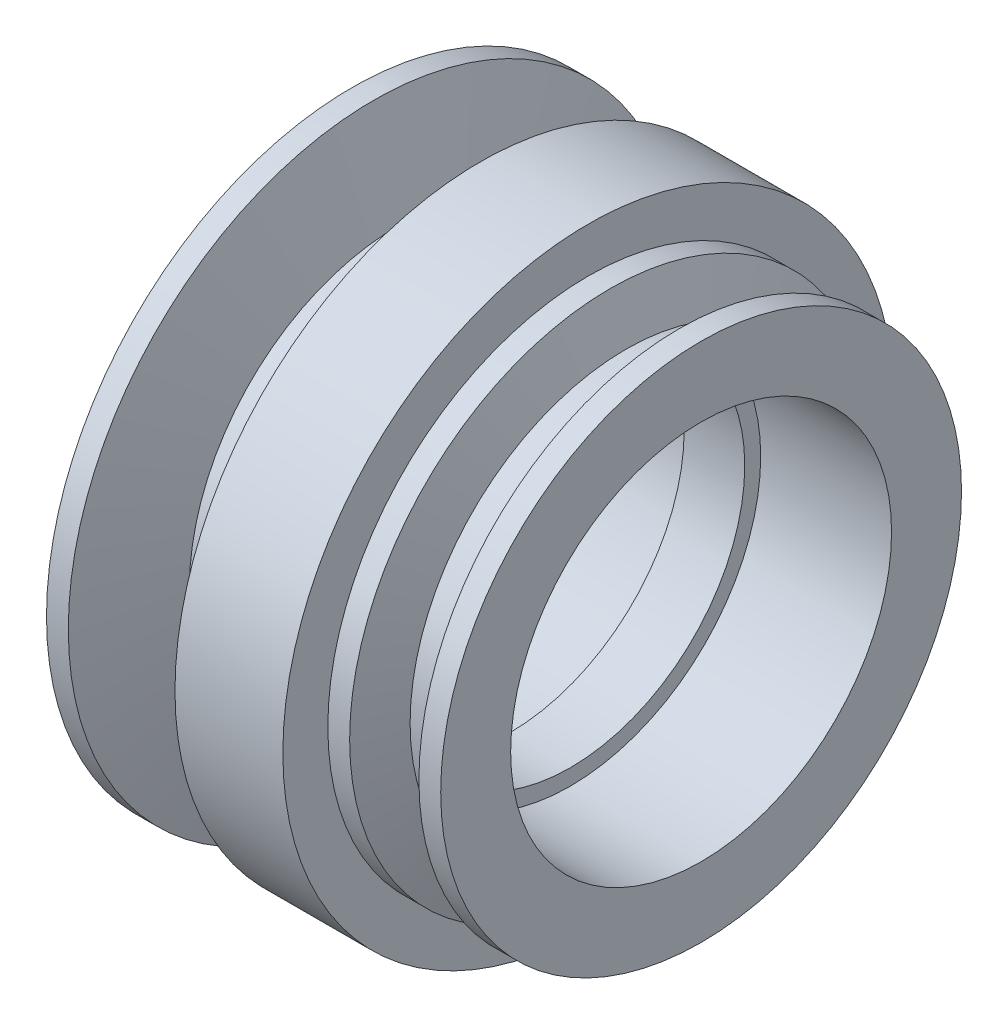
ISO-10303-21;
HEADER;
FILE_DESCRIPTION(('STEP AP214'),'2;1');
FILE_NAME('part.step','',(''),(''),'','','');
FILE_SCHEMA(('AUTOMOTIVE_DESIGN { 1 0 10303 214 1 1 1 1 }'));
ENDSEC;
DATA;
#1=APPLICATION_CONTEXT('core data for automotive mechanical design processes');
#2=APPLICATION_PROTOCOL_DEFINITION('international standard','automotive_design',2000,#1);
#3=PRODUCT_CONTEXT('',#1,'mechanical');
#4=PRODUCT('Part','Part','',(#3));
#5=PRODUCT_RELATED_PRODUCT_CATEGORY('part','',(#4));
#6=PRODUCT_DEFINITION_FORMATION('','',#4);
#7=PRODUCT_DEFINITION_CONTEXT('part definition',#1,'design');
#8=PRODUCT_DEFINITION('design','',#6,#7);
#9=PRODUCT_DEFINITION_SHAPE('','',#8);
#10=(LENGTH_UNIT() NAMED_UNIT(*) SI_UNIT(.MILLI.,.METRE.));
#11=(NAMED_UNIT(*) PLANE_ANGLE_UNIT() SI_UNIT($,.RADIAN.));
#12=(NAMED_UNIT(*) SI_UNIT($,.STERADIAN.) SOLID_ANGLE_UNIT());
#13=UNCERTAINTY_MEASURE_WITH_UNIT(LENGTH_MEASURE(1.E-05),#10,'distance_accuracy_value','');
#14=(GEOMETRIC_REPRESENTATION_CONTEXT(3) GLOBAL_UNCERTAINTY_ASSIGNED_CONTEXT((#13)) GLOBAL_UNIT_ASSIGNED_CONTEXT((#10,
#11,#12)) REPRESENTATION_CONTEXT('',''));
#15=CARTESIAN_POINT('',(0.,0.,0.));
#16=DIRECTION('',(0.,0.,1.));
#17=DIRECTION('',(1.,0.,0.));
#18=AXIS2_PLACEMENT_3D('',#15,#16,#17);
#19=CARTESIAN_POINT('',(-1.54130278169073,0.,-16.));
#20=DIRECTION('',(1.,0.,0.));
#21=DIRECTION('',(0.,0.,-1.));
#22=AXIS2_PLACEMENT_3D('',#19,#20,#21);
#23=PLANE('',#22);
#24=CARTESIAN_POINT('',(-1.54130278169073,0.,0.));
#25=DIRECTION('',(-1.,0.,0.));
#26=DIRECTION('',(0.,0.,1.));
#27=AXIS2_PLACEMENT_3D('',#24,#25,#26);
#28=CIRCLE('',#27,16.);
#29=CARTESIAN_POINT('',(-1.54130278169073,0.,16.));
#30=VERTEX_POINT('',#29);
#31=EDGE_CURVE('E10',#30,#30,#28,.T.);
#32=ORIENTED_EDGE('',*,*,#31,.F.);
#33=EDGE_LOOP('',(#32));
#34=FACE_BOUND('',#33,.T.);
#35=CARTESIAN_POINT('',(-1.54130278169073,0.,0.));
#36=DIRECTION('',(-1.,0.,0.));
#37=DIRECTION('',(0.,0.,1.));
#38=AXIS2_PLACEMENT_3D('',#35,#36,#37);
#39=CIRCLE('',#38,17.4625);
#40=CARTESIAN_POINT('',(-1.54130278169073,0.,17.4625));
#41=VERTEX_POINT('',#40);
#42=EDGE_CURVE('E95',#41,#41,#39,.T.);
#43=ORIENTED_EDGE('',*,*,#42,.T.);
#44=EDGE_LOOP('',(#43));
#45=FACE_BOUND('',#44,.T.);
#46=ADVANCED_FACE('F37',(#34,#45),#23,.F.);
#47=CARTESIAN_POINT('',(-72.0125837658216,0.,0.));
#48=DIRECTION('',(-1.,0.,0.));
#49=DIRECTION('',(0.,0.,1.));
#50=AXIS2_PLACEMENT_3D('',#47,#48,#49);
#51=CYLINDRICAL_SURFACE('',#50,16.);
#52=CARTESIAN_POINT('',(4.01229721830917,0.,0.));
#53=DIRECTION('',(-1.,0.,0.));
#54=DIRECTION('',(0.,0.,1.));
#55=AXIS2_PLACEMENT_3D('',#52,#53,#54);
#56=CIRCLE('',#55,16.);
#57=CARTESIAN_POINT('',(4.01229721830917,0.,16.));
#58=VERTEX_POINT('',#57);
#59=EDGE_CURVE('E43',#58,#58,#56,.T.);
#60=ORIENTED_EDGE('',*,*,#59,.F.);
#61=EDGE_LOOP('',(#60));
#62=FACE_BOUND('',#61,.T.);
#63=ORIENTED_EDGE('',*,*,#31,.T.);
#64=EDGE_LOOP('',(#63));
#65=FACE_BOUND('',#64,.T.);
#66=ADVANCED_FACE('F192',(#62,#65),#51,.F.);
#67=CARTESIAN_POINT('',(4.01229721830917,0.,-16.));
#68=DIRECTION('',(-1.,0.,0.));
#69=DIRECTION('',(0.,0.,1.));
#70=AXIS2_PLACEMENT_3D('',#67,#68,#69);
#71=PLANE('',#70);
#72=CARTESIAN_POINT('',(4.01229721830917,0.,0.));
#73=DIRECTION('',(-1.,0.,0.));
#74=DIRECTION('',(0.,0.,1.));
#75=AXIS2_PLACEMENT_3D('',#72,#73,#74);
#76=CIRCLE('',#75,17.4625);
#77=CARTESIAN_POINT('',(4.01229721830917,0.,17.4625));
#78=VERTEX_POINT('',#77);
#79=EDGE_CURVE('E47',#78,#78,#76,.T.);
#80=ORIENTED_EDGE('',*,*,#79,.F.);
#81=EDGE_LOOP('',(#80));
#82=FACE_BOUND('',#81,.T.);
#83=ORIENTED_EDGE('',*,*,#59,.T.);
#84=EDGE_LOOP('',(#83));
#85=FACE_BOUND('',#84,.T.);
#86=ADVANCED_FACE('F187',(#82,#85),#71,.F.);
#87=CARTESIAN_POINT('',(-72.0125837658216,0.,0.));
#88=DIRECTION('',(-1.,0.,0.));
#89=DIRECTION('',(0.,0.,1.));
#90=AXIS2_PLACEMENT_3D('',#87,#88,#89);
#91=CYLINDRICAL_SURFACE('',#90,17.4625);
#92=CARTESIAN_POINT('',(16.0104972183091,0.,0.));
#93=DIRECTION('',(-1.,0.,0.));
#94=DIRECTION('',(0.,0.,1.));
#95=AXIS2_PLACEMENT_3D('',#92,#93,#94);
#96=CIRCLE('',#95,17.4625);
#97=CARTESIAN_POINT('',(16.0104972183091,0.,17.4625));
#98=VERTEX_POINT('',#97);
#99=EDGE_CURVE('E51',#98,#98,#96,.T.);
#100=ORIENTED_EDGE('',*,*,#99,.F.);
#101=EDGE_LOOP('',(#100));
#102=FACE_BOUND('',#101,.T.);
#103=ORIENTED_EDGE('',*,*,#79,.T.);
#104=EDGE_LOOP('',(#103));
#105=FACE_BOUND('',#104,.T.);
#106=ADVANCED_FACE('F181',(#102,#105),#91,.F.);
#107=CARTESIAN_POINT('',(16.0104972183091,0.,-23.876));
#108=DIRECTION('',(-1.,0.,0.));
#109=DIRECTION('',(0.,0.,1.));
#110=AXIS2_PLACEMENT_3D('',#107,#108,#109);
#111=PLANE('',#110);
#112=CARTESIAN_POINT('',(16.0104972183092,0.,0.));
#113=DIRECTION('',(-1.,0.,0.));
#114=DIRECTION('',(0.,0.,1.));
#115=AXIS2_PLACEMENT_3D('',#112,#113,#114);
#116=CIRCLE('',#115,23.876);
#117=CARTESIAN_POINT('',(16.0104972183092,0.,23.876));
#118=VERTEX_POINT('',#117);
#119=EDGE_CURVE('E56',#118,#118,#116,.T.);
#120=ORIENTED_EDGE('',*,*,#119,.F.);
#121=EDGE_LOOP('',(#120));
#122=FACE_BOUND('',#121,.T.);
#123=ORIENTED_EDGE('',*,*,#99,.T.);
#124=EDGE_LOOP('',(#123));
#125=FACE_BOUND('',#124,.T.);
#126=ADVANCED_FACE('F175',(#122,#125),#111,.F.);
#127=CARTESIAN_POINT('',(-72.0125837658216,0.,0.));
#128=DIRECTION('',(-1.,0.,0.));
#129=DIRECTION('',(0.,0.,1.));
#130=AXIS2_PLACEMENT_3D('',#127,#128,#129);
#131=CYLINDRICAL_SURFACE('',#130,23.876);
#132=CARTESIAN_POINT('',(14.0104972183092,0.,0.));
#133=DIRECTION('',(-1.,0.,0.));
#134=DIRECTION('',(0.,0.,1.));
#135=AXIS2_PLACEMENT_3D('',#132,#133,#134);
#136=CIRCLE('',#135,23.876);
#137=CARTESIAN_POINT('',(14.0104972183092,0.,23.876));
#138=VERTEX_POINT('',#137);
#139=EDGE_CURVE('E59',#138,#138,#136,.T.);
#140=ORIENTED_EDGE('',*,*,#139,.F.);
#141=EDGE_LOOP('',(#140));
#142=FACE_BOUND('',#141,.T.);
#143=ORIENTED_EDGE('',*,*,#119,.T.);
#144=EDGE_LOOP('',(#143));
#145=FACE_BOUND('',#144,.T.);
#146=ADVANCED_FACE('F169',(#142,#145),#131,.T.);
#147=CARTESIAN_POINT('',(14.0104972183092,0.,0.));
#148=DIRECTION('',(1.,0.,0.));
#149=DIRECTION('',(0.,0.,-1.));
#150=AXIS2_PLACEMENT_3D('',#147,#148,#149);
#151=CONICAL_SURFACE('',#150,23.876,1.22173047639603);
#152=CARTESIAN_POINT('',(12.5313221862513,0.,0.));
#153=DIRECTION('',(-1.,0.,0.));
#154=DIRECTION('',(0.,0.,1.));
#155=AXIS2_PLACEMENT_3D('',#152,#153,#154);
#156=CIRCLE('',#155,19.812);
#157=CARTESIAN_POINT('',(12.5313221862513,0.,19.812));
#158=VERTEX_POINT('',#157);
#159=EDGE_CURVE('E62',#158,#158,#156,.T.);
#160=ORIENTED_EDGE('',*,*,#159,.F.);
#161=EDGE_LOOP('',(#160));
#162=FACE_BOUND('',#161,.T.);
#163=ORIENTED_EDGE('',*,*,#139,.T.);
#164=EDGE_LOOP('',(#163));
#165=FACE_BOUND('',#164,.T.);
#166=ADVANCED_FACE('F163',(#162,#165),#151,.T.);
#167=CARTESIAN_POINT('',(-72.0125837658216,0.,0.));
#168=DIRECTION('',(-1.,0.,0.));
#169=DIRECTION('',(0.,0.,1.));
#170=AXIS2_PLACEMENT_3D('',#167,#168,#169);
#171=CYLINDRICAL_SURFACE('',#170,19.812);
#172=CARTESIAN_POINT('',(9.13967225036697,0.,0.));
#173=DIRECTION('',(-1.,0.,0.));
#174=DIRECTION('',(0.,0.,1.));
#175=AXIS2_PLACEMENT_3D('',#172,#173,#174);
#176=CIRCLE('',#175,19.812);
#177=CARTESIAN_POINT('',(9.13967225036697,0.,19.812));
#178=VERTEX_POINT('',#177);
#179=EDGE_CURVE('E65',#178,#178,#176,.T.);
#180=ORIENTED_EDGE('',*,*,#179,.F.);
#181=EDGE_LOOP('',(#180));
#182=FACE_BOUND('',#181,.T.);
#183=ORIENTED_EDGE('',*,*,#159,.T.);
#184=EDGE_LOOP('',(#183));
#185=FACE_BOUND('',#184,.T.);
#186=ADVANCED_FACE('F157',(#182,#185),#171,.T.);
#187=CARTESIAN_POINT('',(9.13967225036697,0.,0.));
#188=DIRECTION('',(-1.,0.,0.));
#189=DIRECTION('',(0.,0.,1.));
#190=AXIS2_PLACEMENT_3D('',#187,#188,#189);
#191=CONICAL_SURFACE('',#190,19.812,1.22173047639603);
#192=CARTESIAN_POINT('',(7.66049721830914,0.,0.));
#193=DIRECTION('',(-1.,0.,0.));
#194=DIRECTION('',(0.,0.,1.));
#195=AXIS2_PLACEMENT_3D('',#192,#193,#194);
#196=CIRCLE('',#195,23.876);
#197=CARTESIAN_POINT('',(7.66049721830914,0.,23.876));
#198=VERTEX_POINT('',#197);
#199=EDGE_CURVE('E68',#198,#198,#196,.T.);
#200=ORIENTED_EDGE('',*,*,#199,.F.);
#201=EDGE_LOOP('',(#200));
#202=FACE_BOUND('',#201,.T.);
#203=ORIENTED_EDGE('',*,*,#179,.T.);
#204=EDGE_LOOP('',(#203));
#205=FACE_BOUND('',#204,.T.);
#206=ADVANCED_FACE('F151',(#202,#205),#191,.T.);
#207=CARTESIAN_POINT('',(-72.0125837658216,0.,0.));
#208=DIRECTION('',(-1.,0.,0.));
#209=DIRECTION('',(0.,0.,1.));
#210=AXIS2_PLACEMENT_3D('',#207,#208,#209);
#211=CYLINDRICAL_SURFACE('',#210,23.876);
#212=CARTESIAN_POINT('',(5.66049721830914,0.,0.));
#213=DIRECTION('',(-1.,0.,0.));
#214=DIRECTION('',(0.,0.,1.));
#215=AXIS2_PLACEMENT_3D('',#212,#213,#214);
#216=CIRCLE('',#215,23.876);
#217=CARTESIAN_POINT('',(5.66049721830914,0.,23.876));
#218=VERTEX_POINT('',#217);
#219=EDGE_CURVE('E71',#218,#218,#216,.T.);
#220=ORIENTED_EDGE('',*,*,#219,.F.);
#221=EDGE_LOOP('',(#220));
#222=FACE_BOUND('',#221,.T.);
#223=ORIENTED_EDGE('',*,*,#199,.T.);
#224=EDGE_LOOP('',(#223));
#225=FACE_BOUND('',#224,.T.);
#226=ADVANCED_FACE('F145',(#222,#225),#211,.T.);
#227=CARTESIAN_POINT('',(5.66049721830914,0.,-28.));
#228=DIRECTION('',(-1.,0.,0.));
#229=DIRECTION('',(0.,0.,1.));
#230=AXIS2_PLACEMENT_3D('',#227,#228,#229);
#231=PLANE('',#230);
#232=CARTESIAN_POINT('',(5.66049721830914,0.,0.));
#233=DIRECTION('',(-1.,0.,0.));
#234=DIRECTION('',(0.,0.,1.));
#235=AXIS2_PLACEMENT_3D('',#232,#233,#234);
#236=CIRCLE('',#235,28.);
#237=CARTESIAN_POINT('',(5.66049721830914,0.,28.));
#238=VERTEX_POINT('',#237);
#239=EDGE_CURVE('E74',#238,#238,#236,.T.);
#240=ORIENTED_EDGE('',*,*,#239,.F.);
#241=EDGE_LOOP('',(#240));
#242=FACE_BOUND('',#241,.T.);
#243=ORIENTED_EDGE('',*,*,#219,.T.);
#244=EDGE_LOOP('',(#243));
#245=FACE_BOUND('',#244,.T.);
#246=ADVANCED_FACE('F139',(#242,#245),#231,.F.);
#247=CARTESIAN_POINT('',(-72.0125837658216,0.,0.));
#248=DIRECTION('',(-1.,0.,0.));
#249=DIRECTION('',(0.,0.,1.));
#250=AXIS2_PLACEMENT_3D('',#247,#248,#249);
#251=CYLINDRICAL_SURFACE('',#250,28.);
#252=CARTESIAN_POINT('',(-4.23149721830912,0.,0.));
#253=DIRECTION('',(-1.,0.,0.));
#254=DIRECTION('',(0.,0.,1.));
#255=AXIS2_PLACEMENT_3D('',#252,#253,#254);
#256=CIRCLE('',#255,28.);
#257=CARTESIAN_POINT('',(-4.23149721830912,0.,28.));
#258=VERTEX_POINT('',#257);
#259=EDGE_CURVE('E77',#258,#258,#256,.T.);
#260=ORIENTED_EDGE('',*,*,#259,.F.);
#261=EDGE_LOOP('',(#260));
#262=FACE_BOUND('',#261,.T.);
#263=ORIENTED_EDGE('',*,*,#239,.T.);
#264=EDGE_LOOP('',(#263));
#265=FACE_BOUND('',#264,.T.);
#266=ADVANCED_FACE('F133',(#262,#265),#251,.T.);
#267=CARTESIAN_POINT('',(-4.23149721830912,0.,0.));
#268=DIRECTION('',(1.,0.,0.));
#269=DIRECTION('',(0.,0.,-1.));
#270=AXIS2_PLACEMENT_3D('',#267,#268,#269);
#271=CONICAL_SURFACE('',#270,28.,1.32645023151569);
#272=CARTESIAN_POINT('',(-6.44802316358498,0.,0.));
#273=DIRECTION('',(-1.,0.,0.));
#274=DIRECTION('',(0.,0.,1.));
#275=AXIS2_PLACEMENT_3D('',#272,#273,#274);
#276=CIRCLE('',#275,19.11);
#277=CARTESIAN_POINT('',(-6.44802316358498,0.,19.11));
#278=VERTEX_POINT('',#277);
#279=EDGE_CURVE('E80',#278,#278,#276,.T.);
#280=ORIENTED_EDGE('',*,*,#279,.F.);
#281=EDGE_LOOP('',(#280));
#282=FACE_BOUND('',#281,.T.);
#283=ORIENTED_EDGE('',*,*,#259,.T.);
#284=EDGE_LOOP('',(#283));
#285=FACE_BOUND('',#284,.T.);
#286=ADVANCED_FACE('F127',(#282,#285),#271,.T.);
#287=CARTESIAN_POINT('',(-72.0125837658216,0.,0.));
#288=DIRECTION('',(-1.,0.,0.));
#289=DIRECTION('',(0.,0.,1.));
#290=AXIS2_PLACEMENT_3D('',#287,#288,#289);
#291=CYLINDRICAL_SURFACE('',#290,19.11);
#292=CARTESIAN_POINT('',(-11.7939712730332,0.,0.));
#293=DIRECTION('',(-1.,0.,0.));
#294=DIRECTION('',(0.,0.,1.));
#295=AXIS2_PLACEMENT_3D('',#292,#293,#294);
#296=CIRCLE('',#295,19.11);
#297=CARTESIAN_POINT('',(-11.7939712730332,0.,19.11));
#298=VERTEX_POINT('',#297);
#299=EDGE_CURVE('E83',#298,#298,#296,.T.);
#300=ORIENTED_EDGE('',*,*,#299,.F.);
#301=EDGE_LOOP('',(#300));
#302=FACE_BOUND('',#301,.T.);
#303=ORIENTED_EDGE('',*,*,#279,.T.);
#304=EDGE_LOOP('',(#303));
#305=FACE_BOUND('',#304,.T.);
#306=ADVANCED_FACE('F121',(#302,#305),#291,.T.);
#307=CARTESIAN_POINT('',(-11.7939712730332,0.,0.));
#308=DIRECTION('',(-1.,0.,0.));
#309=DIRECTION('',(0.,0.,1.));
#310=AXIS2_PLACEMENT_3D('',#307,#308,#309);
#311=CONICAL_SURFACE('',#310,19.11,1.32645023151569);
#312=CARTESIAN_POINT('',(-14.0104972183091,0.,0.));
#313=DIRECTION('',(-1.,0.,0.));
#314=DIRECTION('',(0.,0.,1.));
#315=AXIS2_PLACEMENT_3D('',#312,#313,#314);
#316=CIRCLE('',#315,28.);
#317=CARTESIAN_POINT('',(-14.0104972183091,0.,28.));
#318=VERTEX_POINT('',#317);
#319=EDGE_CURVE('E86',#318,#318,#316,.T.);
#320=ORIENTED_EDGE('',*,*,#319,.F.);
#321=EDGE_LOOP('',(#320));
#322=FACE_BOUND('',#321,.T.);
#323=ORIENTED_EDGE('',*,*,#299,.T.);
#324=EDGE_LOOP('',(#323));
#325=FACE_BOUND('',#324,.T.);
#326=ADVANCED_FACE('F115',(#322,#325),#311,.T.);
#327=CARTESIAN_POINT('',(-72.0125837658216,0.,0.));
#328=DIRECTION('',(-1.,0.,0.));
#329=DIRECTION('',(0.,0.,1.));
#330=AXIS2_PLACEMENT_3D('',#327,#328,#329);
#331=CYLINDRICAL_SURFACE('',#330,28.);
#332=CARTESIAN_POINT('',(-16.0104972183091,0.,0.));
#333=DIRECTION('',(-1.,0.,0.));
#334=DIRECTION('',(0.,0.,1.));
#335=AXIS2_PLACEMENT_3D('',#332,#333,#334);
#336=CIRCLE('',#335,28.);
#337=CARTESIAN_POINT('',(-16.0104972183091,0.,28.));
#338=VERTEX_POINT('',#337);
#339=EDGE_CURVE('E89',#338,#338,#336,.T.);
#340=ORIENTED_EDGE('',*,*,#339,.F.);
#341=EDGE_LOOP('',(#340));
#342=FACE_BOUND('',#341,.T.);
#343=ORIENTED_EDGE('',*,*,#319,.T.);
#344=EDGE_LOOP('',(#343));
#345=FACE_BOUND('',#344,.T.);
#346=ADVANCED_FACE('F109',(#342,#345),#331,.T.);
#347=CARTESIAN_POINT('',(-16.0104972183091,0.,-28.));
#348=DIRECTION('',(1.,0.,0.));
#349=DIRECTION('',(0.,0.,-1.));
#350=AXIS2_PLACEMENT_3D('',#347,#348,#349);
#351=PLANE('',#350);
#352=CARTESIAN_POINT('',(-16.0104972183091,0.,0.));
#353=DIRECTION('',(-1.,0.,0.));
#354=DIRECTION('',(0.,0.,1.));
#355=AXIS2_PLACEMENT_3D('',#352,#353,#354);
#356=CIRCLE('',#355,17.4625);
#357=CARTESIAN_POINT('',(-16.0104972183091,0.,17.4625));
#358=VERTEX_POINT('',#357);
#359=EDGE_CURVE('E92',#358,#358,#356,.T.);
#360=ORIENTED_EDGE('',*,*,#359,.F.);
#361=EDGE_LOOP('',(#360));
#362=FACE_BOUND('',#361,.T.);
#363=ORIENTED_EDGE('',*,*,#339,.T.);
#364=EDGE_LOOP('',(#363));
#365=FACE_BOUND('',#364,.T.);
#366=ADVANCED_FACE('F103',(#362,#365),#351,.F.);
#367=CARTESIAN_POINT('',(-72.0125837658216,0.,0.));
#368=DIRECTION('',(-1.,0.,0.));
#369=DIRECTION('',(0.,0.,1.));
#370=AXIS2_PLACEMENT_3D('',#367,#368,#369);
#371=CYLINDRICAL_SURFACE('',#370,17.4625);
#372=ORIENTED_EDGE('',*,*,#42,.F.);
#373=EDGE_LOOP('',(#372));
#374=FACE_BOUND('',#373,.T.);
#375=ORIENTED_EDGE('',*,*,#359,.T.);
#376=EDGE_LOOP('',(#375));
#377=FACE_BOUND('',#376,.T.);
#378=ADVANCED_FACE('F100',(#374,#377),#371,.F.);
#379=CLOSED_SHELL('',(#46,#66,#86,#106,#126,#146,#166,#186,#206,#226,#246,#266,#286,#306,#326,
#346,#366,#378));
#380=MANIFOLD_SOLID_BREP('B2',#379);
#381=ADVANCED_BREP_SHAPE_REPRESENTATION('',(#18,#380),#14);
#382=SHAPE_DEFINITION_REPRESENTATION(#9,#381);
ENDSEC;
END-ISO-10303-21;
